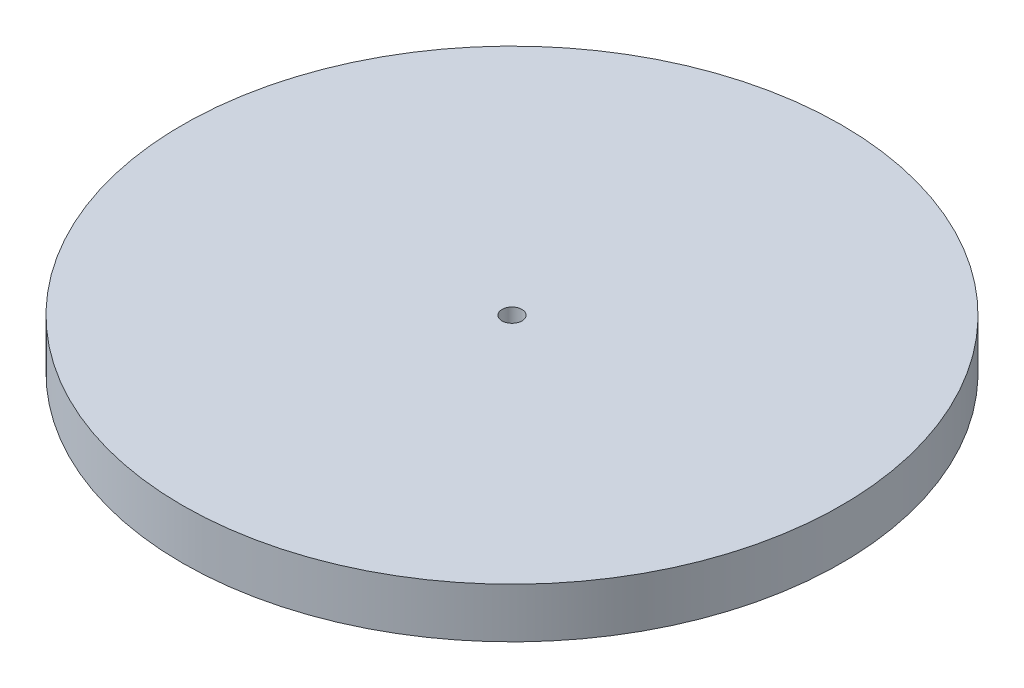
ISO-10303-21;
HEADER;
FILE_DESCRIPTION(('STEP AP214'),'2;1');
FILE_NAME('part.step','',(''),(''),'','','');
FILE_SCHEMA(('AUTOMOTIVE_DESIGN { 1 0 10303 214 1 1 1 1 }'));
ENDSEC;
DATA;
#1=APPLICATION_CONTEXT('core data for automotive mechanical design processes');
#2=APPLICATION_PROTOCOL_DEFINITION('international standard','automotive_design',2000,#1);
#3=PRODUCT_CONTEXT('',#1,'mechanical');
#4=PRODUCT('Part','Part','',(#3));
#5=PRODUCT_RELATED_PRODUCT_CATEGORY('part','',(#4));
#6=PRODUCT_DEFINITION_FORMATION('','',#4);
#7=PRODUCT_DEFINITION_CONTEXT('part definition',#1,'design');
#8=PRODUCT_DEFINITION('design','',#6,#7);
#9=PRODUCT_DEFINITION_SHAPE('','',#8);
#10=(LENGTH_UNIT() NAMED_UNIT(*) SI_UNIT(.MILLI.,.METRE.));
#11=(NAMED_UNIT(*) PLANE_ANGLE_UNIT() SI_UNIT($,.RADIAN.));
#12=(NAMED_UNIT(*) SI_UNIT($,.STERADIAN.) SOLID_ANGLE_UNIT());
#13=UNCERTAINTY_MEASURE_WITH_UNIT(LENGTH_MEASURE(1.E-05),#10,'distance_accuracy_value','');
#14=(GEOMETRIC_REPRESENTATION_CONTEXT(3) GLOBAL_UNCERTAINTY_ASSIGNED_CONTEXT((#13)) GLOBAL_UNIT_ASSIGNED_CONTEXT((#10,
#11,#12)) REPRESENTATION_CONTEXT('',''));
#15=CARTESIAN_POINT('',(0.,0.,0.));
#16=DIRECTION('',(0.,0.,1.));
#17=DIRECTION('',(1.,0.,0.));
#18=AXIS2_PLACEMENT_3D('',#15,#16,#17);
#19=CARTESIAN_POINT('',(0.,10.,0.));
#20=DIRECTION('',(0.,-1.,0.));
#21=DIRECTION('',(0.,0.,-1.));
#22=AXIS2_PLACEMENT_3D('',#19,#20,#21);
#23=CYLINDRICAL_SURFACE('',#22,66.);
#24=CARTESIAN_POINT('',(0.,10.,0.));
#25=DIRECTION('',(0.,1.,0.));
#26=DIRECTION('',(0.,0.,1.));
#27=AXIS2_PLACEMENT_3D('',#24,#25,#26);
#28=CIRCLE('',#27,66.);
#29=CARTESIAN_POINT('',(0.,10.,66.));
#30=VERTEX_POINT('',#29);
#31=EDGE_CURVE('E10',#30,#30,#28,.T.);
#32=ORIENTED_EDGE('',*,*,#31,.F.);
#33=EDGE_LOOP('',(#32));
#34=FACE_BOUND('',#33,.T.);
#35=CARTESIAN_POINT('',(0.,0.,0.));
#36=DIRECTION('',(0.,1.,0.));
#37=DIRECTION('',(0.,0.,1.));
#38=AXIS2_PLACEMENT_3D('',#35,#36,#37);
#39=CIRCLE('',#38,66.);
#40=CARTESIAN_POINT('',(0.,0.,66.));
#41=VERTEX_POINT('',#40);
#42=EDGE_CURVE('E46',#41,#41,#39,.T.);
#43=ORIENTED_EDGE('',*,*,#42,.T.);
#44=EDGE_LOOP('',(#43));
#45=FACE_BOUND('',#44,.T.);
#46=ADVANCED_FACE('F43',(#34,#45),#23,.T.);
#47=CARTESIAN_POINT('',(0.,10.,0.));
#48=DIRECTION('',(0.,1.,0.));
#49=DIRECTION('',(0.,0.,1.));
#50=AXIS2_PLACEMENT_3D('',#47,#48,#49);
#51=PLANE('',#50);
#52=CARTESIAN_POINT('',(0.,10.,0.));
#53=DIRECTION('',(0.,1.,0.));
#54=DIRECTION('',(0.,0.,1.));
#55=AXIS2_PLACEMENT_3D('',#52,#53,#54);
#56=CIRCLE('',#55,2.);
#57=CARTESIAN_POINT('',(0.,10.,2.));
#58=VERTEX_POINT('',#57);
#59=EDGE_CURVE('E57',#58,#58,#56,.T.);
#60=ORIENTED_EDGE('',*,*,#59,.F.);
#61=EDGE_LOOP('',(#60));
#62=FACE_BOUND('',#61,.T.);
#63=ORIENTED_EDGE('',*,*,#31,.T.);
#64=EDGE_LOOP('',(#63));
#65=FACE_BOUND('',#64,.T.);
#66=ADVANCED_FACE('F74',(#62,#65),#51,.T.);
#67=CARTESIAN_POINT('',(0.,0.,0.));
#68=DIRECTION('',(0.,1.,0.));
#69=DIRECTION('',(0.,0.,1.));
#70=AXIS2_PLACEMENT_3D('',#67,#68,#69);
#71=PLANE('',#70);
#72=CARTESIAN_POINT('',(0.,0.,0.));
#73=DIRECTION('',(0.,1.,0.));
#74=DIRECTION('',(0.,0.,1.));
#75=AXIS2_PLACEMENT_3D('',#72,#73,#74);
#76=CIRCLE('',#75,2.);
#77=CARTESIAN_POINT('',(0.,0.,2.));
#78=VERTEX_POINT('',#77);
#79=EDGE_CURVE('E55',#78,#78,#76,.T.);
#80=ORIENTED_EDGE('',*,*,#79,.T.);
#81=EDGE_LOOP('',(#80));
#82=FACE_BOUND('',#81,.T.);
#83=ORIENTED_EDGE('',*,*,#42,.F.);
#84=EDGE_LOOP('',(#83));
#85=FACE_BOUND('',#84,.T.);
#86=ADVANCED_FACE('F65',(#82,#85),#71,.F.);
#87=CARTESIAN_POINT('',(0.,0.,0.));
#88=DIRECTION('',(0.,1.,0.));
#89=DIRECTION('',(0.,0.,1.));
#90=AXIS2_PLACEMENT_3D('',#87,#88,#89);
#91=CYLINDRICAL_SURFACE('',#90,2.);
#92=ORIENTED_EDGE('',*,*,#79,.F.);
#93=EDGE_LOOP('',(#92));
#94=FACE_BOUND('',#93,.T.);
#95=ORIENTED_EDGE('',*,*,#59,.T.);
#96=EDGE_LOOP('',(#95));
#97=FACE_BOUND('',#96,.T.);
#98=ADVANCED_FACE('F68',(#94,#97),#91,.F.);
#99=CLOSED_SHELL('',(#46,#66,#86,#98));
#100=MANIFOLD_SOLID_BREP('B2',#99);
#101=ADVANCED_BREP_SHAPE_REPRESENTATION('',(#18,#100),#14);
#102=SHAPE_DEFINITION_REPRESENTATION(#9,#101);
ENDSEC;
END-ISO-10303-21;
